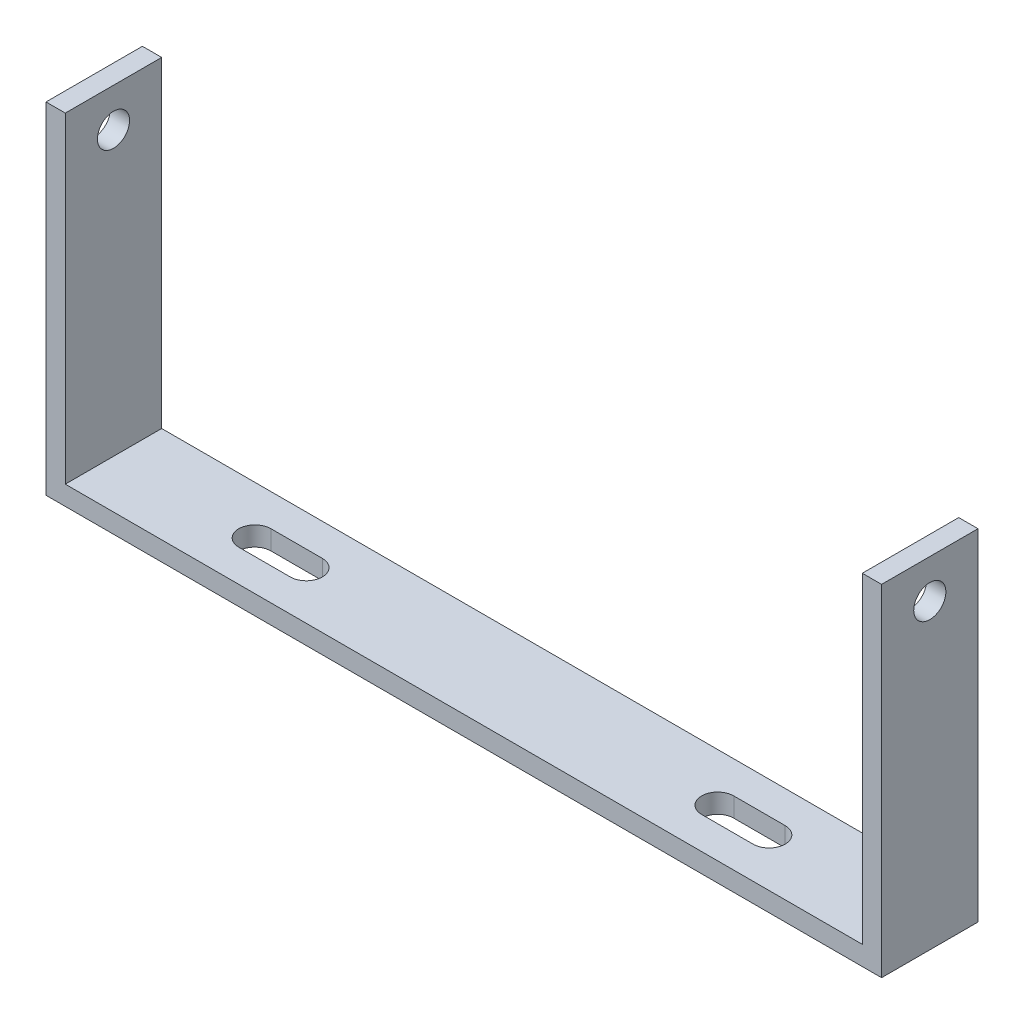
ISO-10303-21;
HEADER;
FILE_DESCRIPTION(('STEP AP214'),'2;1');
FILE_NAME('part.step','',(''),(''),'','','');
FILE_SCHEMA(('AUTOMOTIVE_DESIGN { 1 0 10303 214 1 1 1 1 }'));
ENDSEC;
DATA;
#1=APPLICATION_CONTEXT('core data for automotive mechanical design processes');
#2=APPLICATION_PROTOCOL_DEFINITION('international standard','automotive_design',2000,#1);
#3=PRODUCT_CONTEXT('',#1,'mechanical');
#4=PRODUCT('Part','Part','',(#3));
#5=PRODUCT_RELATED_PRODUCT_CATEGORY('part','',(#4));
#6=PRODUCT_DEFINITION_FORMATION('','',#4);
#7=PRODUCT_DEFINITION_CONTEXT('part definition',#1,'design');
#8=PRODUCT_DEFINITION('design','',#6,#7);
#9=PRODUCT_DEFINITION_SHAPE('','',#8);
#10=(LENGTH_UNIT() NAMED_UNIT(*) SI_UNIT(.MILLI.,.METRE.));
#11=(NAMED_UNIT(*) PLANE_ANGLE_UNIT() SI_UNIT($,.RADIAN.));
#12=(NAMED_UNIT(*) SI_UNIT($,.STERADIAN.) SOLID_ANGLE_UNIT());
#13=UNCERTAINTY_MEASURE_WITH_UNIT(LENGTH_MEASURE(1.E-05),#10,'distance_accuracy_value','');
#14=(GEOMETRIC_REPRESENTATION_CONTEXT(3) GLOBAL_UNCERTAINTY_ASSIGNED_CONTEXT((#13)) GLOBAL_UNIT_ASSIGNED_CONTEXT((#10,
#11,#12)) REPRESENTATION_CONTEXT('',''));
#15=CARTESIAN_POINT('',(0.,0.,0.));
#16=DIRECTION('',(0.,0.,1.));
#17=DIRECTION('',(1.,0.,0.));
#18=AXIS2_PLACEMENT_3D('',#15,#16,#17);
#19=CARTESIAN_POINT('',(0.,3.,0.));
#20=DIRECTION('',(0.,1.,0.));
#21=DIRECTION('',(0.,0.,1.));
#22=AXIS2_PLACEMENT_3D('',#19,#20,#21);
#23=PLANE('',#22);
#24=CARTESIAN_POINT('',(-40.,3.,0.));
#25=DIRECTION('',(0.,1.,0.));
#26=DIRECTION('',(0.,0.,1.));
#27=AXIS2_PLACEMENT_3D('',#24,#25,#26);
#28=CIRCLE('',#27,2.5);
#29=CARTESIAN_POINT('',(-40.,3.,-2.5));
#30=VERTEX_POINT('',#29);
#31=CARTESIAN_POINT('',(-40.,3.,2.5));
#32=VERTEX_POINT('',#31);
#33=EDGE_CURVE('E260',#30,#32,#28,.T.);
#34=ORIENTED_EDGE('',*,*,#33,.F.);
#35=DIRECTION('',(-1.,0.,0.));
#36=VECTOR('',#35,1.);
#37=CARTESIAN_POINT('',(-40.,3.,-2.5));
#38=LINE('',#37,#36);
#39=CARTESIAN_POINT('',(-32.,3.,-2.5));
#40=VERTEX_POINT('',#39);
#41=EDGE_CURVE('E239',#40,#30,#38,.T.);
#42=ORIENTED_EDGE('',*,*,#41,.F.);
#43=CARTESIAN_POINT('',(-32.,3.,0.));
#44=DIRECTION('',(0.,1.,0.));
#45=DIRECTION('',(0.,0.,1.));
#46=AXIS2_PLACEMENT_3D('',#43,#44,#45);
#47=CIRCLE('',#46,2.5);
#48=CARTESIAN_POINT('',(-32.,3.,2.5));
#49=VERTEX_POINT('',#48);
#50=EDGE_CURVE('E228',#49,#40,#47,.T.);
#51=ORIENTED_EDGE('',*,*,#50,.F.);
#52=DIRECTION('',(1.,0.,0.));
#53=VECTOR('',#52,1.);
#54=CARTESIAN_POINT('',(-40.,3.,2.5));
#55=LINE('',#54,#53);
#56=EDGE_CURVE('E264',#32,#49,#55,.T.);
#57=ORIENTED_EDGE('',*,*,#56,.F.);
#58=EDGE_LOOP('',(#34,#42,#51,#57));
#59=FACE_BOUND('',#58,.T.);
#60=CARTESIAN_POINT('',(32.,3.,0.));
#61=DIRECTION('',(0.,1.,0.));
#62=DIRECTION('',(0.,0.,-1.));
#63=AXIS2_PLACEMENT_3D('',#60,#61,#62);
#64=CIRCLE('',#63,2.5);
#65=CARTESIAN_POINT('',(32.,3.,-2.5));
#66=VERTEX_POINT('',#65);
#67=CARTESIAN_POINT('',(32.,3.,2.5));
#68=VERTEX_POINT('',#67);
#69=EDGE_CURVE('E174',#66,#68,#64,.T.);
#70=ORIENTED_EDGE('',*,*,#69,.F.);
#71=DIRECTION('',(-1.,0.,0.));
#72=VECTOR('',#71,1.);
#73=CARTESIAN_POINT('',(40.,3.,-2.5));
#74=LINE('',#73,#72);
#75=CARTESIAN_POINT('',(40.,3.,-2.5));
#76=VERTEX_POINT('',#75);
#77=EDGE_CURVE('E243',#76,#66,#74,.T.);
#78=ORIENTED_EDGE('',*,*,#77,.F.);
#79=CARTESIAN_POINT('',(40.,3.,0.));
#80=DIRECTION('',(0.,1.,0.));
#81=DIRECTION('',(0.,0.,-1.));
#82=AXIS2_PLACEMENT_3D('',#79,#80,#81);
#83=CIRCLE('',#82,2.5);
#84=CARTESIAN_POINT('',(40.,3.,2.5));
#85=VERTEX_POINT('',#84);
#86=EDGE_CURVE('E253',#85,#76,#83,.T.);
#87=ORIENTED_EDGE('',*,*,#86,.F.);
#88=DIRECTION('',(1.,0.,0.));
#89=VECTOR('',#88,1.);
#90=CARTESIAN_POINT('',(40.,3.,2.5));
#91=LINE('',#90,#89);
#92=EDGE_CURVE('E255',#68,#85,#91,.T.);
#93=ORIENTED_EDGE('',*,*,#92,.F.);
#94=EDGE_LOOP('',(#70,#78,#87,#93));
#95=FACE_BOUND('',#94,.T.);
#96=DIRECTION('',(1.,0.,0.));
#97=VECTOR('',#96,1.);
#98=CARTESIAN_POINT('',(-65.,3.,7.5));
#99=LINE('',#98,#97);
#100=CARTESIAN_POINT('',(-62.,3.,7.5));
#101=VERTEX_POINT('',#100);
#102=CARTESIAN_POINT('',(62.,3.,7.5));
#103=VERTEX_POINT('',#102);
#104=EDGE_CURVE('E161',#101,#103,#99,.T.);
#105=ORIENTED_EDGE('',*,*,#104,.T.);
#106=DIRECTION('',(0.,0.,1.));
#107=VECTOR('',#106,1.);
#108=CARTESIAN_POINT('',(62.,3.,7.5));
#109=LINE('',#108,#107);
#110=CARTESIAN_POINT('',(62.,3.,-7.50000000000001));
#111=VERTEX_POINT('',#110);
#112=EDGE_CURVE('E150',#111,#103,#109,.T.);
#113=ORIENTED_EDGE('',*,*,#112,.F.);
#114=DIRECTION('',(-1.,0.,0.));
#115=VECTOR('',#114,1.);
#116=CARTESIAN_POINT('',(-65.,3.,-7.5));
#117=LINE('',#116,#115);
#118=CARTESIAN_POINT('',(-62.,3.,-7.50000000000001));
#119=VERTEX_POINT('',#118);
#120=EDGE_CURVE('E166',#111,#119,#117,.T.);
#121=ORIENTED_EDGE('',*,*,#120,.T.);
#122=DIRECTION('',(0.,0.,-1.));
#123=VECTOR('',#122,1.);
#124=CARTESIAN_POINT('',(-62.,3.,7.5));
#125=LINE('',#124,#123);
#126=EDGE_CURVE('E60',#101,#119,#125,.T.);
#127=ORIENTED_EDGE('',*,*,#126,.F.);
#128=EDGE_LOOP('',(#105,#113,#121,#127));
#129=FACE_BOUND('',#128,.T.);
#130=ADVANCED_FACE('F36',(#59,#95,#129),#23,.T.);
#131=CARTESIAN_POINT('',(-65.,3.,-7.5));
#132=DIRECTION('',(1.,0.,0.));
#133=DIRECTION('',(0.,0.,-1.));
#134=AXIS2_PLACEMENT_3D('',#131,#132,#133);
#135=PLANE('',#134);
#136=CARTESIAN_POINT('',(-65.,47.,0.));
#137=DIRECTION('',(-1.,0.,0.));
#138=DIRECTION('',(0.,0.,1.));
#139=AXIS2_PLACEMENT_3D('',#136,#137,#138);
#140=CIRCLE('',#139,2.5);
#141=CARTESIAN_POINT('',(-65.,47.,2.5));
#142=VERTEX_POINT('',#141);
#143=EDGE_CURVE('E520',#142,#142,#140,.T.);
#144=ORIENTED_EDGE('',*,*,#143,.F.);
#145=EDGE_LOOP('',(#144));
#146=FACE_BOUND('',#145,.T.);
#147=DIRECTION('',(0.,0.,1.));
#148=VECTOR('',#147,1.);
#149=CARTESIAN_POINT('',(-65.,0.,-7.5));
#150=LINE('',#149,#148);
#151=CARTESIAN_POINT('',(-65.,0.,-7.5));
#152=VERTEX_POINT('',#151);
#153=CARTESIAN_POINT('',(-65.,0.,7.5));
#154=VERTEX_POINT('',#153);
#155=EDGE_CURVE('E177',#152,#154,#150,.T.);
#156=ORIENTED_EDGE('',*,*,#155,.T.);
#157=DIRECTION('',(0.,-1.,0.));
#158=VECTOR('',#157,1.);
#159=CARTESIAN_POINT('',(-65.,3.,7.5));
#160=LINE('',#159,#158);
#161=CARTESIAN_POINT('',(-65.,53.,7.5));
#162=VERTEX_POINT('',#161);
#163=EDGE_CURVE('E192',#162,#154,#160,.T.);
#164=ORIENTED_EDGE('',*,*,#163,.F.);
#165=DIRECTION('',(0.,0.,1.));
#166=VECTOR('',#165,1.);
#167=CARTESIAN_POINT('',(-65.,53.,7.5));
#168=LINE('',#167,#166);
#169=CARTESIAN_POINT('',(-65.,53.,-7.50000000000001));
#170=VERTEX_POINT('',#169);
#171=EDGE_CURVE('E539',#170,#162,#168,.T.);
#172=ORIENTED_EDGE('',*,*,#171,.F.);
#173=DIRECTION('',(0.,-1.,0.));
#174=VECTOR('',#173,1.);
#175=CARTESIAN_POINT('',(-65.,3.,-7.5));
#176=LINE('',#175,#174);
#177=EDGE_CURVE('E169',#170,#152,#176,.T.);
#178=ORIENTED_EDGE('',*,*,#177,.T.);
#179=EDGE_LOOP('',(#156,#164,#172,#178));
#180=FACE_BOUND('',#179,.T.);
#181=ADVANCED_FACE('F38',(#146,#180),#135,.F.);
#182=CARTESIAN_POINT('',(-65.,3.,7.5));
#183=DIRECTION('',(0.,0.,-1.));
#184=DIRECTION('',(-1.,0.,0.));
#185=AXIS2_PLACEMENT_3D('',#182,#183,#184);
#186=PLANE('',#185);
#187=DIRECTION('',(1.,0.,0.));
#188=VECTOR('',#187,1.);
#189=CARTESIAN_POINT('',(-65.,0.,7.5));
#190=LINE('',#189,#188);
#191=CARTESIAN_POINT('',(65.,0.,7.49999999999998));
#192=VERTEX_POINT('',#191);
#193=EDGE_CURVE('E180',#154,#192,#190,.T.);
#194=ORIENTED_EDGE('',*,*,#193,.T.);
#195=DIRECTION('',(0.,-1.,0.));
#196=VECTOR('',#195,1.);
#197=CARTESIAN_POINT('',(65.,3.,7.49999999999998));
#198=LINE('',#197,#196);
#199=CARTESIAN_POINT('',(65.,53.,7.5));
#200=VERTEX_POINT('',#199);
#201=EDGE_CURVE('E189',#200,#192,#198,.T.);
#202=ORIENTED_EDGE('',*,*,#201,.F.);
#203=DIRECTION('',(1.,0.,0.));
#204=VECTOR('',#203,1.);
#205=CARTESIAN_POINT('',(65.,53.,7.5));
#206=LINE('',#205,#204);
#207=CARTESIAN_POINT('',(62.,53.,7.5));
#208=VERTEX_POINT('',#207);
#209=EDGE_CURVE('E156',#208,#200,#206,.T.);
#210=ORIENTED_EDGE('',*,*,#209,.F.);
#211=DIRECTION('',(0.,-1.,0.));
#212=VECTOR('',#211,1.);
#213=CARTESIAN_POINT('',(62.,53.,7.5));
#214=LINE('',#213,#212);
#215=EDGE_CURVE('E153',#208,#103,#214,.T.);
#216=ORIENTED_EDGE('',*,*,#215,.T.);
#217=ORIENTED_EDGE('',*,*,#104,.F.);
#218=DIRECTION('',(0.,-1.,0.));
#219=VECTOR('',#218,1.);
#220=CARTESIAN_POINT('',(-62.,53.,7.5));
#221=LINE('',#220,#219);
#222=CARTESIAN_POINT('',(-62.,53.,7.5));
#223=VERTEX_POINT('',#222);
#224=EDGE_CURVE('E250',#223,#101,#221,.T.);
#225=ORIENTED_EDGE('',*,*,#224,.F.);
#226=DIRECTION('',(1.,0.,0.));
#227=VECTOR('',#226,1.);
#228=CARTESIAN_POINT('',(-65.,53.,7.5));
#229=LINE('',#228,#227);
#230=EDGE_CURVE('E542',#162,#223,#229,.T.);
#231=ORIENTED_EDGE('',*,*,#230,.F.);
#232=ORIENTED_EDGE('',*,*,#163,.T.);
#233=EDGE_LOOP('',(#194,#202,#210,#216,#217,#225,#231,#232));
#234=FACE_BOUND('',#233,.T.);
#235=ADVANCED_FACE('F159',(#234),#186,.F.);
#236=CARTESIAN_POINT('',(65.,3.,-7.50000000000001));
#237=DIRECTION('',(-1.,0.,0.));
#238=DIRECTION('',(0.,0.,1.));
#239=AXIS2_PLACEMENT_3D('',#236,#237,#238);
#240=PLANE('',#239);
#241=CARTESIAN_POINT('',(65.,47.,0.));
#242=DIRECTION('',(-1.,0.,0.));
#243=DIRECTION('',(0.,0.,1.));
#244=AXIS2_PLACEMENT_3D('',#241,#242,#243);
#245=CIRCLE('',#244,2.5);
#246=CARTESIAN_POINT('',(65.,47.,2.5));
#247=VERTEX_POINT('',#246);
#248=EDGE_CURVE('E524',#247,#247,#245,.T.);
#249=ORIENTED_EDGE('',*,*,#248,.T.);
#250=EDGE_LOOP('',(#249));
#251=FACE_BOUND('',#250,.T.);
#252=DIRECTION('',(0.,0.,-1.));
#253=VECTOR('',#252,1.);
#254=CARTESIAN_POINT('',(65.,0.,-7.50000000000001));
#255=LINE('',#254,#253);
#256=CARTESIAN_POINT('',(65.,0.,-7.50000000000001));
#257=VERTEX_POINT('',#256);
#258=EDGE_CURVE('E171',#192,#257,#255,.T.);
#259=ORIENTED_EDGE('',*,*,#258,.T.);
#260=DIRECTION('',(0.,-1.,0.));
#261=VECTOR('',#260,1.);
#262=CARTESIAN_POINT('',(65.,3.,-7.50000000000001));
#263=LINE('',#262,#261);
#264=CARTESIAN_POINT('',(65.,53.,-7.50000000000001));
#265=VERTEX_POINT('',#264);
#266=EDGE_CURVE('E186',#265,#257,#263,.T.);
#267=ORIENTED_EDGE('',*,*,#266,.F.);
#268=DIRECTION('',(0.,0.,-1.));
#269=VECTOR('',#268,1.);
#270=CARTESIAN_POINT('',(65.,53.,7.5));
#271=LINE('',#270,#269);
#272=EDGE_CURVE('E535',#200,#265,#271,.T.);
#273=ORIENTED_EDGE('',*,*,#272,.F.);
#274=ORIENTED_EDGE('',*,*,#201,.T.);
#275=EDGE_LOOP('',(#259,#267,#273,#274));
#276=FACE_BOUND('',#275,.T.);
#277=ADVANCED_FACE('F308',(#251,#276),#240,.F.);
#278=CARTESIAN_POINT('',(-65.,3.,-7.5));
#279=DIRECTION('',(0.,0.,1.));
#280=DIRECTION('',(1.,0.,0.));
#281=AXIS2_PLACEMENT_3D('',#278,#279,#280);
#282=PLANE('',#281);
#283=DIRECTION('',(-1.,0.,0.));
#284=VECTOR('',#283,1.);
#285=CARTESIAN_POINT('',(-65.,0.,-7.5));
#286=LINE('',#285,#284);
#287=EDGE_CURVE('E167',#257,#152,#286,.T.);
#288=ORIENTED_EDGE('',*,*,#287,.T.);
#289=ORIENTED_EDGE('',*,*,#177,.F.);
#290=DIRECTION('',(-1.,0.,0.));
#291=VECTOR('',#290,1.);
#292=CARTESIAN_POINT('',(-65.,53.,-7.50000000000001));
#293=LINE('',#292,#291);
#294=CARTESIAN_POINT('',(-62.,53.,-7.50000000000001));
#295=VERTEX_POINT('',#294);
#296=EDGE_CURVE('E546',#295,#170,#293,.T.);
#297=ORIENTED_EDGE('',*,*,#296,.F.);
#298=DIRECTION('',(0.,-1.,0.));
#299=VECTOR('',#298,1.);
#300=CARTESIAN_POINT('',(-62.,53.,-7.50000000000001));
#301=LINE('',#300,#299);
#302=EDGE_CURVE('E549',#295,#119,#301,.T.);
#303=ORIENTED_EDGE('',*,*,#302,.T.);
#304=ORIENTED_EDGE('',*,*,#120,.F.);
#305=DIRECTION('',(0.,-1.,0.));
#306=VECTOR('',#305,1.);
#307=CARTESIAN_POINT('',(62.,53.,-7.50000000000001));
#308=LINE('',#307,#306);
#309=CARTESIAN_POINT('',(62.,53.,-7.50000000000001));
#310=VERTEX_POINT('',#309);
#311=EDGE_CURVE('E52',#310,#111,#308,.T.);
#312=ORIENTED_EDGE('',*,*,#311,.F.);
#313=DIRECTION('',(-1.,0.,0.));
#314=VECTOR('',#313,1.);
#315=CARTESIAN_POINT('',(65.,53.,-7.50000000000001));
#316=LINE('',#315,#314);
#317=EDGE_CURVE('E533',#265,#310,#316,.T.);
#318=ORIENTED_EDGE('',*,*,#317,.F.);
#319=ORIENTED_EDGE('',*,*,#266,.T.);
#320=EDGE_LOOP('',(#288,#289,#297,#303,#304,#312,#318,#319));
#321=FACE_BOUND('',#320,.T.);
#322=ADVANCED_FACE('F305',(#321),#282,.F.);
#323=CARTESIAN_POINT('',(0.,0.,0.));
#324=DIRECTION('',(0.,1.,0.));
#325=DIRECTION('',(0.,0.,1.));
#326=AXIS2_PLACEMENT_3D('',#323,#324,#325);
#327=PLANE('',#326);
#328=DIRECTION('',(-1.,0.,0.));
#329=VECTOR('',#328,1.);
#330=CARTESIAN_POINT('',(0.,0.,-2.5));
#331=LINE('',#330,#329);
#332=CARTESIAN_POINT('',(-32.,0.,-2.5));
#333=VERTEX_POINT('',#332);
#334=CARTESIAN_POINT('',(-40.,0.,-2.5));
#335=VERTEX_POINT('',#334);
#336=EDGE_CURVE('E45',#333,#335,#331,.T.);
#337=ORIENTED_EDGE('',*,*,#336,.T.);
#338=CARTESIAN_POINT('',(-40.,0.,0.));
#339=DIRECTION('',(0.,1.,0.));
#340=DIRECTION('',(0.,0.,1.));
#341=AXIS2_PLACEMENT_3D('',#338,#339,#340);
#342=CIRCLE('',#341,2.5);
#343=CARTESIAN_POINT('',(-40.,0.,2.5));
#344=VERTEX_POINT('',#343);
#345=EDGE_CURVE('E11',#335,#344,#342,.T.);
#346=ORIENTED_EDGE('',*,*,#345,.T.);
#347=DIRECTION('',(1.,0.,0.));
#348=VECTOR('',#347,1.);
#349=CARTESIAN_POINT('',(0.,0.,2.5));
#350=LINE('',#349,#348);
#351=CARTESIAN_POINT('',(-32.,0.,2.5));
#352=VERTEX_POINT('',#351);
#353=EDGE_CURVE('E207',#344,#352,#350,.T.);
#354=ORIENTED_EDGE('',*,*,#353,.T.);
#355=CARTESIAN_POINT('',(-32.,0.,0.));
#356=DIRECTION('',(0.,1.,0.));
#357=DIRECTION('',(0.,0.,1.));
#358=AXIS2_PLACEMENT_3D('',#355,#356,#357);
#359=CIRCLE('',#358,2.5);
#360=EDGE_CURVE('E210',#352,#333,#359,.T.);
#361=ORIENTED_EDGE('',*,*,#360,.T.);
#362=EDGE_LOOP('',(#337,#346,#354,#361));
#363=FACE_BOUND('',#362,.T.);
#364=DIRECTION('',(-1.,0.,0.));
#365=VECTOR('',#364,1.);
#366=CARTESIAN_POINT('',(0.,0.,-2.5));
#367=LINE('',#366,#365);
#368=CARTESIAN_POINT('',(40.,0.,-2.5));
#369=VERTEX_POINT('',#368);
#370=CARTESIAN_POINT('',(32.,0.,-2.5));
#371=VERTEX_POINT('',#370);
#372=EDGE_CURVE('E201',#369,#371,#367,.T.);
#373=ORIENTED_EDGE('',*,*,#372,.T.);
#374=CARTESIAN_POINT('',(32.,0.,0.));
#375=DIRECTION('',(0.,1.,0.));
#376=DIRECTION('',(0.,0.,1.));
#377=AXIS2_PLACEMENT_3D('',#374,#375,#376);
#378=CIRCLE('',#377,2.5);
#379=CARTESIAN_POINT('',(32.,0.,2.5));
#380=VERTEX_POINT('',#379);
#381=EDGE_CURVE('E204',#371,#380,#378,.T.);
#382=ORIENTED_EDGE('',*,*,#381,.T.);
#383=DIRECTION('',(1.,0.,0.));
#384=VECTOR('',#383,1.);
#385=CARTESIAN_POINT('',(0.,0.,2.5));
#386=LINE('',#385,#384);
#387=CARTESIAN_POINT('',(40.,0.,2.5));
#388=VERTEX_POINT('',#387);
#389=EDGE_CURVE('E195',#380,#388,#386,.T.);
#390=ORIENTED_EDGE('',*,*,#389,.T.);
#391=CARTESIAN_POINT('',(40.,0.,0.));
#392=DIRECTION('',(0.,1.,0.));
#393=DIRECTION('',(0.,0.,1.));
#394=AXIS2_PLACEMENT_3D('',#391,#392,#393);
#395=CIRCLE('',#394,2.5);
#396=EDGE_CURVE('E198',#388,#369,#395,.T.);
#397=ORIENTED_EDGE('',*,*,#396,.T.);
#398=EDGE_LOOP('',(#373,#382,#390,#397));
#399=FACE_BOUND('',#398,.T.);
#400=ORIENTED_EDGE('',*,*,#155,.F.);
#401=ORIENTED_EDGE('',*,*,#287,.F.);
#402=ORIENTED_EDGE('',*,*,#258,.F.);
#403=ORIENTED_EDGE('',*,*,#193,.F.);
#404=EDGE_LOOP('',(#400,#401,#402,#403));
#405=FACE_BOUND('',#404,.T.);
#406=ADVANCED_FACE('F215',(#363,#399,#405),#327,.F.);
#407=CARTESIAN_POINT('',(32.,-32.,0.));
#408=DIRECTION('',(0.,1.,0.));
#409=DIRECTION('',(0.,0.,1.));
#410=AXIS2_PLACEMENT_3D('',#407,#408,#409);
#411=CYLINDRICAL_SURFACE('',#410,2.5);
#412=DIRECTION('',(0.,1.,0.));
#413=VECTOR('',#412,1.);
#414=CARTESIAN_POINT('',(32.,-32.,-2.5));
#415=LINE('',#414,#413);
#416=EDGE_CURVE('E248',#371,#66,#415,.T.);
#417=ORIENTED_EDGE('',*,*,#416,.T.);
#418=ORIENTED_EDGE('',*,*,#69,.T.);
#419=DIRECTION('',(0.,1.,0.));
#420=VECTOR('',#419,1.);
#421=CARTESIAN_POINT('',(32.,-32.,2.5));
#422=LINE('',#421,#420);
#423=EDGE_CURVE('E240',#380,#68,#422,.T.);
#424=ORIENTED_EDGE('',*,*,#423,.F.);
#425=ORIENTED_EDGE('',*,*,#381,.F.);
#426=EDGE_LOOP('',(#417,#418,#424,#425));
#427=FACE_BOUND('',#426,.T.);
#428=ADVANCED_FACE('F304',(#427),#411,.F.);
#429=CARTESIAN_POINT('',(40.,-32.,-2.5));
#430=DIRECTION('',(0.,0.,-1.));
#431=DIRECTION('',(-1.,0.,0.));
#432=AXIS2_PLACEMENT_3D('',#429,#430,#431);
#433=PLANE('',#432);
#434=DIRECTION('',(0.,1.,0.));
#435=VECTOR('',#434,1.);
#436=CARTESIAN_POINT('',(40.,-32.,-2.5));
#437=LINE('',#436,#435);
#438=EDGE_CURVE('E246',#369,#76,#437,.T.);
#439=ORIENTED_EDGE('',*,*,#438,.T.);
#440=ORIENTED_EDGE('',*,*,#77,.T.);
#441=ORIENTED_EDGE('',*,*,#416,.F.);
#442=ORIENTED_EDGE('',*,*,#372,.F.);
#443=EDGE_LOOP('',(#439,#440,#441,#442));
#444=FACE_BOUND('',#443,.T.);
#445=ADVANCED_FACE('F300',(#444),#433,.F.);
#446=CARTESIAN_POINT('',(40.,-32.,0.));
#447=DIRECTION('',(0.,1.,0.));
#448=DIRECTION('',(0.,0.,1.));
#449=AXIS2_PLACEMENT_3D('',#446,#447,#448);
#450=CYLINDRICAL_SURFACE('',#449,2.5);
#451=DIRECTION('',(0.,1.,0.));
#452=VECTOR('',#451,1.);
#453=CARTESIAN_POINT('',(40.,-32.,2.5));
#454=LINE('',#453,#452);
#455=EDGE_CURVE('E244',#388,#85,#454,.T.);
#456=ORIENTED_EDGE('',*,*,#455,.T.);
#457=ORIENTED_EDGE('',*,*,#86,.T.);
#458=ORIENTED_EDGE('',*,*,#438,.F.);
#459=ORIENTED_EDGE('',*,*,#396,.F.);
#460=EDGE_LOOP('',(#456,#457,#458,#459));
#461=FACE_BOUND('',#460,.T.);
#462=ADVANCED_FACE('F288',(#461),#450,.F.);
#463=CARTESIAN_POINT('',(40.,-32.,2.5));
#464=DIRECTION('',(0.,0.,1.));
#465=DIRECTION('',(1.,0.,0.));
#466=AXIS2_PLACEMENT_3D('',#463,#464,#465);
#467=PLANE('',#466);
#468=ORIENTED_EDGE('',*,*,#423,.T.);
#469=ORIENTED_EDGE('',*,*,#92,.T.);
#470=ORIENTED_EDGE('',*,*,#455,.F.);
#471=ORIENTED_EDGE('',*,*,#389,.F.);
#472=EDGE_LOOP('',(#468,#469,#470,#471));
#473=FACE_BOUND('',#472,.T.);
#474=ADVANCED_FACE('F281',(#473),#467,.F.);
#475=CARTESIAN_POINT('',(-40.,-32.,0.));
#476=DIRECTION('',(0.,1.,0.));
#477=DIRECTION('',(0.,0.,1.));
#478=AXIS2_PLACEMENT_3D('',#475,#476,#477);
#479=CYLINDRICAL_SURFACE('',#478,2.5);
#480=DIRECTION('',(0.,1.,0.));
#481=VECTOR('',#480,1.);
#482=CARTESIAN_POINT('',(-40.,-32.,-2.5));
#483=LINE('',#482,#481);
#484=EDGE_CURVE('E181',#335,#30,#483,.T.);
#485=ORIENTED_EDGE('',*,*,#484,.T.);
#486=ORIENTED_EDGE('',*,*,#33,.T.);
#487=DIRECTION('',(0.,1.,0.));
#488=VECTOR('',#487,1.);
#489=CARTESIAN_POINT('',(-40.,-32.,2.5));
#490=LINE('',#489,#488);
#491=EDGE_CURVE('E233',#344,#32,#490,.T.);
#492=ORIENTED_EDGE('',*,*,#491,.F.);
#493=ORIENTED_EDGE('',*,*,#345,.F.);
#494=EDGE_LOOP('',(#485,#486,#492,#493));
#495=FACE_BOUND('',#494,.T.);
#496=ADVANCED_FACE('F279',(#495),#479,.F.);
#497=CARTESIAN_POINT('',(-40.,-32.,-2.5));
#498=DIRECTION('',(0.,0.,-1.));
#499=DIRECTION('',(-1.,0.,0.));
#500=AXIS2_PLACEMENT_3D('',#497,#498,#499);
#501=PLANE('',#500);
#502=DIRECTION('',(0.,1.,0.));
#503=VECTOR('',#502,1.);
#504=CARTESIAN_POINT('',(-32.,-32.,-2.5));
#505=LINE('',#504,#503);
#506=EDGE_CURVE('E223',#333,#40,#505,.T.);
#507=ORIENTED_EDGE('',*,*,#506,.T.);
#508=ORIENTED_EDGE('',*,*,#41,.T.);
#509=ORIENTED_EDGE('',*,*,#484,.F.);
#510=ORIENTED_EDGE('',*,*,#336,.F.);
#511=EDGE_LOOP('',(#507,#508,#509,#510));
#512=FACE_BOUND('',#511,.T.);
#513=ADVANCED_FACE('F221',(#512),#501,.F.);
#514=CARTESIAN_POINT('',(-32.,-32.,0.));
#515=DIRECTION('',(0.,1.,0.));
#516=DIRECTION('',(0.,0.,1.));
#517=AXIS2_PLACEMENT_3D('',#514,#515,#516);
#518=CYLINDRICAL_SURFACE('',#517,2.5);
#519=DIRECTION('',(0.,1.,0.));
#520=VECTOR('',#519,1.);
#521=CARTESIAN_POINT('',(-32.,-32.,2.5));
#522=LINE('',#521,#520);
#523=EDGE_CURVE('E230',#352,#49,#522,.T.);
#524=ORIENTED_EDGE('',*,*,#523,.T.);
#525=ORIENTED_EDGE('',*,*,#50,.T.);
#526=ORIENTED_EDGE('',*,*,#506,.F.);
#527=ORIENTED_EDGE('',*,*,#360,.F.);
#528=EDGE_LOOP('',(#524,#525,#526,#527));
#529=FACE_BOUND('',#528,.T.);
#530=ADVANCED_FACE('F226',(#529),#518,.F.);
#531=CARTESIAN_POINT('',(-40.,-32.,2.5));
#532=DIRECTION('',(0.,0.,1.));
#533=DIRECTION('',(1.,0.,0.));
#534=AXIS2_PLACEMENT_3D('',#531,#532,#533);
#535=PLANE('',#534);
#536=ORIENTED_EDGE('',*,*,#491,.T.);
#537=ORIENTED_EDGE('',*,*,#56,.T.);
#538=ORIENTED_EDGE('',*,*,#523,.F.);
#539=ORIENTED_EDGE('',*,*,#353,.F.);
#540=EDGE_LOOP('',(#536,#537,#538,#539));
#541=FACE_BOUND('',#540,.T.);
#542=ADVANCED_FACE('F278',(#541),#535,.F.);
#543=CARTESIAN_POINT('',(-62.,53.,7.5));
#544=DIRECTION('',(-1.,0.,0.));
#545=DIRECTION('',(0.,0.,1.));
#546=AXIS2_PLACEMENT_3D('',#543,#544,#545);
#547=PLANE('',#546);
#548=CARTESIAN_POINT('',(-62.,47.,0.));
#549=DIRECTION('',(-1.,0.,0.));
#550=DIRECTION('',(0.,0.,1.));
#551=AXIS2_PLACEMENT_3D('',#548,#549,#550);
#552=CIRCLE('',#551,2.5);
#553=CARTESIAN_POINT('',(-62.,47.,2.5));
#554=VERTEX_POINT('',#553);
#555=EDGE_CURVE('E523',#554,#554,#552,.T.);
#556=ORIENTED_EDGE('',*,*,#555,.T.);
#557=EDGE_LOOP('',(#556));
#558=FACE_BOUND('',#557,.T.);
#559=ORIENTED_EDGE('',*,*,#126,.T.);
#560=ORIENTED_EDGE('',*,*,#302,.F.);
#561=DIRECTION('',(0.,0.,-1.));
#562=VECTOR('',#561,1.);
#563=CARTESIAN_POINT('',(-62.,53.,7.5));
#564=LINE('',#563,#562);
#565=EDGE_CURVE('E544',#223,#295,#564,.T.);
#566=ORIENTED_EDGE('',*,*,#565,.F.);
#567=ORIENTED_EDGE('',*,*,#224,.T.);
#568=EDGE_LOOP('',(#559,#560,#566,#567));
#569=FACE_BOUND('',#568,.T.);
#570=ADVANCED_FACE('F382',(#558,#569),#547,.F.);
#571=CARTESIAN_POINT('',(0.,53.,0.));
#572=DIRECTION('',(0.,-1.,0.));
#573=DIRECTION('',(0.,0.,-1.));
#574=AXIS2_PLACEMENT_3D('',#571,#572,#573);
#575=PLANE('',#574);
#576=ORIENTED_EDGE('',*,*,#171,.T.);
#577=ORIENTED_EDGE('',*,*,#230,.T.);
#578=ORIENTED_EDGE('',*,*,#565,.T.);
#579=ORIENTED_EDGE('',*,*,#296,.T.);
#580=EDGE_LOOP('',(#576,#577,#578,#579));
#581=FACE_BOUND('',#580,.T.);
#582=ADVANCED_FACE('F400',(#581),#575,.F.);
#583=CARTESIAN_POINT('',(62.,53.,7.5));
#584=DIRECTION('',(1.,0.,0.));
#585=DIRECTION('',(0.,0.,-1.));
#586=AXIS2_PLACEMENT_3D('',#583,#584,#585);
#587=PLANE('',#586);
#588=CARTESIAN_POINT('',(62.,47.,0.));
#589=DIRECTION('',(1.,0.,0.));
#590=DIRECTION('',(0.,0.,-1.));
#591=AXIS2_PLACEMENT_3D('',#588,#589,#590);
#592=CIRCLE('',#591,2.5);
#593=CARTESIAN_POINT('',(62.,47.,-2.5));
#594=VERTEX_POINT('',#593);
#595=EDGE_CURVE('E40',#594,#594,#592,.T.);
#596=ORIENTED_EDGE('',*,*,#595,.T.);
#597=EDGE_LOOP('',(#596));
#598=FACE_BOUND('',#597,.T.);
#599=ORIENTED_EDGE('',*,*,#112,.T.);
#600=ORIENTED_EDGE('',*,*,#215,.F.);
#601=DIRECTION('',(0.,0.,1.));
#602=VECTOR('',#601,1.);
#603=CARTESIAN_POINT('',(62.,53.,7.5));
#604=LINE('',#603,#602);
#605=EDGE_CURVE('E164',#310,#208,#604,.T.);
#606=ORIENTED_EDGE('',*,*,#605,.F.);
#607=ORIENTED_EDGE('',*,*,#311,.T.);
#608=EDGE_LOOP('',(#599,#600,#606,#607));
#609=FACE_BOUND('',#608,.T.);
#610=ADVANCED_FACE('F152',(#598,#609),#587,.F.);
#611=CARTESIAN_POINT('',(0.,53.,0.));
#612=DIRECTION('',(0.,-1.,0.));
#613=DIRECTION('',(0.,0.,-1.));
#614=AXIS2_PLACEMENT_3D('',#611,#612,#613);
#615=PLANE('',#614);
#616=ORIENTED_EDGE('',*,*,#209,.T.);
#617=ORIENTED_EDGE('',*,*,#272,.T.);
#618=ORIENTED_EDGE('',*,*,#317,.T.);
#619=ORIENTED_EDGE('',*,*,#605,.T.);
#620=EDGE_LOOP('',(#616,#617,#618,#619));
#621=FACE_BOUND('',#620,.T.);
#622=ADVANCED_FACE('F417',(#621),#615,.F.);
#623=CARTESIAN_POINT('',(95.,47.,0.));
#624=DIRECTION('',(-1.,0.,0.));
#625=DIRECTION('',(0.,0.,1.));
#626=AXIS2_PLACEMENT_3D('',#623,#624,#625);
#627=CYLINDRICAL_SURFACE('',#626,2.5);
#628=ORIENTED_EDGE('',*,*,#595,.F.);
#629=EDGE_LOOP('',(#628));
#630=FACE_BOUND('',#629,.T.);
#631=ORIENTED_EDGE('',*,*,#248,.F.);
#632=EDGE_LOOP('',(#631));
#633=FACE_BOUND('',#632,.T.);
#634=ADVANCED_FACE('F427',(#630,#633),#627,.F.);
#635=ORIENTED_EDGE('',*,*,#143,.T.);
#636=EDGE_LOOP('',(#635));
#637=FACE_BOUND('',#636,.T.);
#638=ORIENTED_EDGE('',*,*,#555,.F.);
#639=EDGE_LOOP('',(#638));
#640=FACE_BOUND('',#639,.T.);
#641=ADVANCED_FACE('F437',(#637,#640),#627,.F.);
#642=CLOSED_SHELL('',(#130,#181,#235,#277,#322,#406,#428,#445,#462,#474,#496,#513,#530,#542,
#570,#582,#610,#622,#634,#641));
#643=MANIFOLD_SOLID_BREP('B2',#642);
#644=ADVANCED_BREP_SHAPE_REPRESENTATION('',(#18,#643),#14);
#645=SHAPE_DEFINITION_REPRESENTATION(#9,#644);
ENDSEC;
END-ISO-10303-21;
